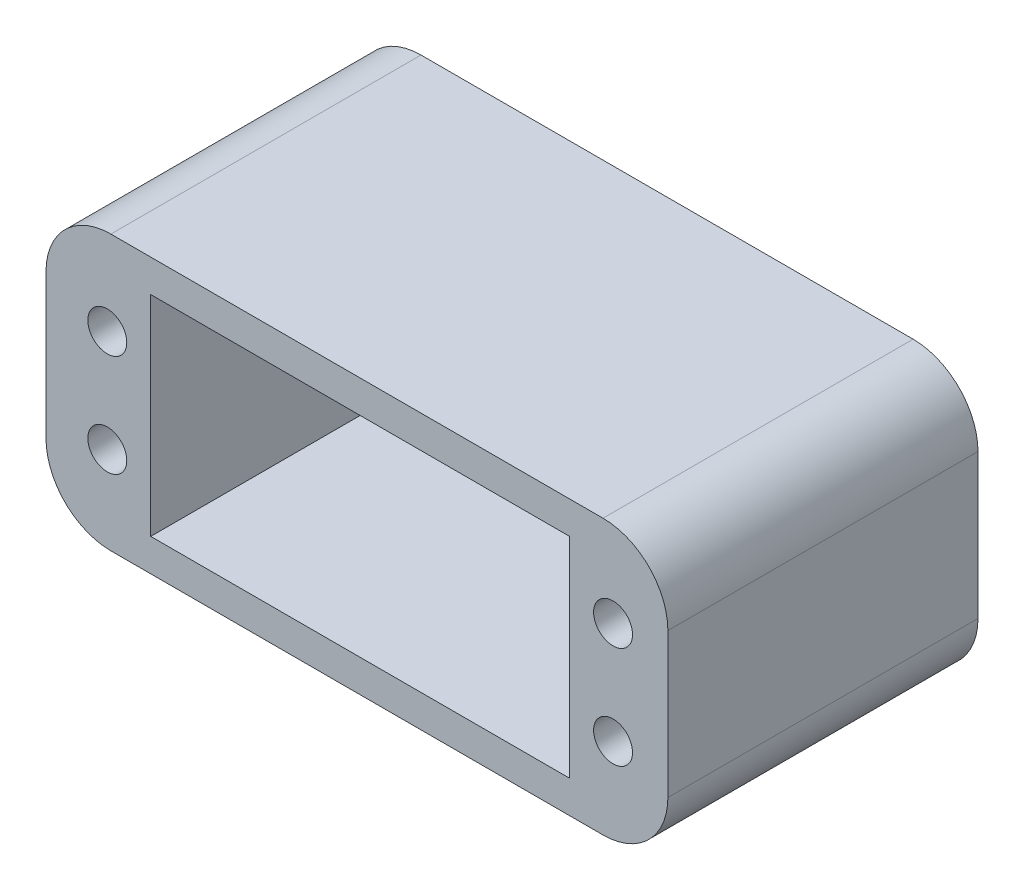
ISO-10303-21;
HEADER;
FILE_DESCRIPTION(('STEP AP214'),'2;1');
FILE_NAME('part.step','',(''),(''),'','','');
FILE_SCHEMA(('AUTOMOTIVE_DESIGN { 1 0 10303 214 1 1 1 1 }'));
ENDSEC;
DATA;
#1=APPLICATION_CONTEXT('core data for automotive mechanical design processes');
#2=APPLICATION_PROTOCOL_DEFINITION('international standard','automotive_design',2000,#1);
#3=PRODUCT_CONTEXT('',#1,'mechanical');
#4=PRODUCT('Part','Part','',(#3));
#5=PRODUCT_RELATED_PRODUCT_CATEGORY('part','',(#4));
#6=PRODUCT_DEFINITION_FORMATION('','',#4);
#7=PRODUCT_DEFINITION_CONTEXT('part definition',#1,'design');
#8=PRODUCT_DEFINITION('design','',#6,#7);
#9=PRODUCT_DEFINITION_SHAPE('','',#8);
#10=(LENGTH_UNIT() NAMED_UNIT(*) SI_UNIT(.MILLI.,.METRE.));
#11=(NAMED_UNIT(*) PLANE_ANGLE_UNIT() SI_UNIT($,.RADIAN.));
#12=(NAMED_UNIT(*) SI_UNIT($,.STERADIAN.) SOLID_ANGLE_UNIT());
#13=UNCERTAINTY_MEASURE_WITH_UNIT(LENGTH_MEASURE(1.E-05),#10,'distance_accuracy_value','');
#14=(GEOMETRIC_REPRESENTATION_CONTEXT(3) GLOBAL_UNCERTAINTY_ASSIGNED_CONTEXT((#13)) GLOBAL_UNIT_ASSIGNED_CONTEXT((#10,
#11,#12)) REPRESENTATION_CONTEXT('',''));
#15=CARTESIAN_POINT('',(0.,0.,0.));
#16=DIRECTION('',(0.,0.,1.));
#17=DIRECTION('',(1.,0.,0.));
#18=AXIS2_PLACEMENT_3D('',#15,#16,#17);
#19=CARTESIAN_POINT('',(23.7658833742651,7.075,15.1765));
#20=DIRECTION('',(0.,0.,-1.));
#21=DIRECTION('',(-1.,0.,0.));
#22=AXIS2_PLACEMENT_3D('',#19,#20,#21);
#23=CYLINDRICAL_SURFACE('',#22,6.35);
#24=CARTESIAN_POINT('',(23.7658833742651,7.075,-15.1765));
#25=DIRECTION('',(0.,0.,1.));
#26=DIRECTION('',(-1.,0.,0.));
#27=AXIS2_PLACEMENT_3D('',#24,#25,#26);
#28=CIRCLE('',#27,6.35);
#29=CARTESIAN_POINT('',(30.1158833742651,7.075,-15.1765));
#30=VERTEX_POINT('',#29);
#31=CARTESIAN_POINT('',(23.7658833742651,13.425,-15.1765));
#32=VERTEX_POINT('',#31);
#33=EDGE_CURVE('E268',#30,#32,#28,.T.);
#34=ORIENTED_EDGE('',*,*,#33,.T.);
#35=DIRECTION('',(0.,0.,-1.));
#36=VECTOR('',#35,1.);
#37=CARTESIAN_POINT('',(23.7658833742651,13.425,15.1765));
#38=LINE('',#37,#36);
#39=CARTESIAN_POINT('',(23.7658833742651,13.425,15.1765));
#40=VERTEX_POINT('',#39);
#41=EDGE_CURVE('E12',#40,#32,#38,.T.);
#42=ORIENTED_EDGE('',*,*,#41,.F.);
#43=CARTESIAN_POINT('',(23.7658833742651,7.075,15.1765));
#44=DIRECTION('',(0.,0.,1.));
#45=DIRECTION('',(-1.,0.,0.));
#46=AXIS2_PLACEMENT_3D('',#43,#44,#45);
#47=CIRCLE('',#46,6.35);
#48=CARTESIAN_POINT('',(30.1158833742651,7.075,15.1765));
#49=VERTEX_POINT('',#48);
#50=EDGE_CURVE('E269',#49,#40,#47,.T.);
#51=ORIENTED_EDGE('',*,*,#50,.F.);
#52=DIRECTION('',(0.,0.,-1.));
#53=VECTOR('',#52,1.);
#54=CARTESIAN_POINT('',(30.1158833742651,7.075,15.1765));
#55=LINE('',#54,#53);
#56=EDGE_CURVE('E295',#49,#30,#55,.T.);
#57=ORIENTED_EDGE('',*,*,#56,.T.);
#58=EDGE_LOOP('',(#34,#42,#51,#57));
#59=FACE_BOUND('',#58,.T.);
#60=ADVANCED_FACE('F40',(#59),#23,.T.);
#61=CARTESIAN_POINT('',(23.7658833742651,13.425,15.1765));
#62=DIRECTION('',(0.,-1.,0.));
#63=DIRECTION('',(1.,0.,0.));
#64=AXIS2_PLACEMENT_3D('',#61,#62,#63);
#65=PLANE('',#64);
#66=DIRECTION('',(-1.,0.,0.));
#67=VECTOR('',#66,1.);
#68=CARTESIAN_POINT('',(23.7658833742651,13.425,-15.1765));
#69=LINE('',#68,#67);
#70=CARTESIAN_POINT('',(-24.4,13.425,-15.1765));
#71=VERTEX_POINT('',#70);
#72=EDGE_CURVE('E299',#32,#71,#69,.T.);
#73=ORIENTED_EDGE('',*,*,#72,.T.);
#74=DIRECTION('',(0.,0.,-1.));
#75=VECTOR('',#74,1.);
#76=CARTESIAN_POINT('',(-24.4,13.425,15.1765));
#77=LINE('',#76,#75);
#78=CARTESIAN_POINT('',(-24.4,13.425,15.1765));
#79=VERTEX_POINT('',#78);
#80=EDGE_CURVE('E48',#79,#71,#77,.T.);
#81=ORIENTED_EDGE('',*,*,#80,.F.);
#82=DIRECTION('',(-1.,0.,0.));
#83=VECTOR('',#82,1.);
#84=CARTESIAN_POINT('',(23.7658833742651,13.425,15.1765));
#85=LINE('',#84,#83);
#86=EDGE_CURVE('E273',#40,#79,#85,.T.);
#87=ORIENTED_EDGE('',*,*,#86,.F.);
#88=ORIENTED_EDGE('',*,*,#41,.T.);
#89=EDGE_LOOP('',(#73,#81,#87,#88));
#90=FACE_BOUND('',#89,.T.);
#91=ADVANCED_FACE('F368',(#90),#65,.F.);
#92=CARTESIAN_POINT('',(-24.4,7.07500000000003,15.1765));
#93=DIRECTION('',(0.,0.,-1.));
#94=DIRECTION('',(-1.,0.,0.));
#95=AXIS2_PLACEMENT_3D('',#92,#93,#94);
#96=CYLINDRICAL_SURFACE('',#95,6.35);
#97=CARTESIAN_POINT('',(-24.4,7.07500000000003,-15.1765));
#98=DIRECTION('',(0.,0.,1.));
#99=DIRECTION('',(1.,0.,0.));
#100=AXIS2_PLACEMENT_3D('',#97,#98,#99);
#101=CIRCLE('',#100,6.35);
#102=CARTESIAN_POINT('',(-30.75,7.07500000000003,-15.1765));
#103=VERTEX_POINT('',#102);
#104=EDGE_CURVE('E302',#71,#103,#101,.T.);
#105=ORIENTED_EDGE('',*,*,#104,.T.);
#106=DIRECTION('',(0.,0.,-1.));
#107=VECTOR('',#106,1.);
#108=CARTESIAN_POINT('',(-30.75,7.07500000000003,15.1765));
#109=LINE('',#108,#107);
#110=CARTESIAN_POINT('',(-30.75,7.07500000000003,15.1765));
#111=VERTEX_POINT('',#110);
#112=EDGE_CURVE('E338',#111,#103,#109,.T.);
#113=ORIENTED_EDGE('',*,*,#112,.F.);
#114=CARTESIAN_POINT('',(-24.4,7.07500000000003,15.1765));
#115=DIRECTION('',(0.,0.,1.));
#116=DIRECTION('',(1.,0.,0.));
#117=AXIS2_PLACEMENT_3D('',#114,#115,#116);
#118=CIRCLE('',#117,6.35);
#119=EDGE_CURVE('E277',#79,#111,#118,.T.);
#120=ORIENTED_EDGE('',*,*,#119,.F.);
#121=ORIENTED_EDGE('',*,*,#80,.T.);
#122=EDGE_LOOP('',(#105,#113,#120,#121));
#123=FACE_BOUND('',#122,.T.);
#124=ADVANCED_FACE('F347',(#123),#96,.T.);
#125=CARTESIAN_POINT('',(-30.75,7.07500000000003,15.1765));
#126=DIRECTION('',(1.,0.,0.));
#127=DIRECTION('',(0.,1.,0.));
#128=AXIS2_PLACEMENT_3D('',#125,#126,#127);
#129=PLANE('',#128);
#130=DIRECTION('',(0.,0.,1.));
#131=VECTOR('',#130,1.);
#132=CARTESIAN_POINT('',(-30.75,-4.76249999999999,-10.3505));
#133=LINE('',#132,#131);
#134=CARTESIAN_POINT('',(-30.75,-4.76249999999999,-10.3505));
#135=VERTEX_POINT('',#134);
#136=CARTESIAN_POINT('',(-30.75,-4.76249999999999,-4.0005));
#137=VERTEX_POINT('',#136);
#138=EDGE_CURVE('E166',#135,#137,#133,.T.);
#139=ORIENTED_EDGE('',*,*,#138,.F.);
#140=DIRECTION('',(0.,-1.,0.));
#141=VECTOR('',#140,1.);
#142=CARTESIAN_POINT('',(-30.75,4.76250000000001,-10.3505));
#143=LINE('',#142,#141);
#144=CARTESIAN_POINT('',(-30.75,4.76250000000001,-10.3505));
#145=VERTEX_POINT('',#144);
#146=EDGE_CURVE('E55',#145,#135,#143,.T.);
#147=ORIENTED_EDGE('',*,*,#146,.F.);
#148=DIRECTION('',(0.,0.,-1.));
#149=VECTOR('',#148,1.);
#150=CARTESIAN_POINT('',(-30.75,4.76250000000001,-10.3505));
#151=LINE('',#150,#149);
#152=CARTESIAN_POINT('',(-30.75,4.76250000000001,-4.0005));
#153=VERTEX_POINT('',#152);
#154=EDGE_CURVE('E174',#153,#145,#151,.T.);
#155=ORIENTED_EDGE('',*,*,#154,.F.);
#156=DIRECTION('',(0.,1.,0.));
#157=VECTOR('',#156,1.);
#158=CARTESIAN_POINT('',(-30.75,4.76250000000001,-4.0005));
#159=LINE('',#158,#157);
#160=EDGE_CURVE('E156',#137,#153,#159,.T.);
#161=ORIENTED_EDGE('',*,*,#160,.F.);
#162=EDGE_LOOP('',(#139,#147,#155,#161));
#163=FACE_BOUND('',#162,.T.);
#164=DIRECTION('',(0.,-1.,0.));
#165=VECTOR('',#164,1.);
#166=CARTESIAN_POINT('',(-30.75,7.07500000000003,-15.1765));
#167=LINE('',#166,#165);
#168=CARTESIAN_POINT('',(-30.75,-7.07500000000001,-15.1765));
#169=VERTEX_POINT('',#168);
#170=EDGE_CURVE('E305',#103,#169,#167,.T.);
#171=ORIENTED_EDGE('',*,*,#170,.T.);
#172=DIRECTION('',(0.,0.,-1.));
#173=VECTOR('',#172,1.);
#174=CARTESIAN_POINT('',(-30.75,-7.07500000000001,15.1765));
#175=LINE('',#174,#173);
#176=CARTESIAN_POINT('',(-30.75,-7.07500000000001,15.1765));
#177=VERTEX_POINT('',#176);
#178=EDGE_CURVE('E334',#177,#169,#175,.T.);
#179=ORIENTED_EDGE('',*,*,#178,.F.);
#180=DIRECTION('',(0.,-1.,0.));
#181=VECTOR('',#180,1.);
#182=CARTESIAN_POINT('',(-30.75,7.07500000000003,15.1765));
#183=LINE('',#182,#181);
#184=EDGE_CURVE('E280',#111,#177,#183,.T.);
#185=ORIENTED_EDGE('',*,*,#184,.F.);
#186=ORIENTED_EDGE('',*,*,#112,.T.);
#187=EDGE_LOOP('',(#171,#179,#185,#186));
#188=FACE_BOUND('',#187,.T.);
#189=ADVANCED_FACE('F171',(#163,#188),#129,.F.);
#190=CARTESIAN_POINT('',(-24.4,-7.07500000000001,15.1765));
#191=DIRECTION('',(0.,0.,-1.));
#192=DIRECTION('',(-1.,0.,0.));
#193=AXIS2_PLACEMENT_3D('',#190,#191,#192);
#194=CYLINDRICAL_SURFACE('',#193,6.35);
#195=CARTESIAN_POINT('',(-24.4,-7.07500000000001,-15.1765));
#196=DIRECTION('',(0.,0.,1.));
#197=DIRECTION('',(1.,0.,0.));
#198=AXIS2_PLACEMENT_3D('',#195,#196,#197);
#199=CIRCLE('',#198,6.35);
#200=CARTESIAN_POINT('',(-24.4,-13.425,-15.1765));
#201=VERTEX_POINT('',#200);
#202=EDGE_CURVE('E308',#169,#201,#199,.T.);
#203=ORIENTED_EDGE('',*,*,#202,.T.);
#204=DIRECTION('',(0.,0.,-1.));
#205=VECTOR('',#204,1.);
#206=CARTESIAN_POINT('',(-24.4,-13.425,15.1765));
#207=LINE('',#206,#205);
#208=CARTESIAN_POINT('',(-24.4,-13.425,15.1765));
#209=VERTEX_POINT('',#208);
#210=EDGE_CURVE('E330',#209,#201,#207,.T.);
#211=ORIENTED_EDGE('',*,*,#210,.F.);
#212=CARTESIAN_POINT('',(-24.4,-7.07500000000001,15.1765));
#213=DIRECTION('',(0.,0.,1.));
#214=DIRECTION('',(1.,0.,0.));
#215=AXIS2_PLACEMENT_3D('',#212,#213,#214);
#216=CIRCLE('',#215,6.35);
#217=EDGE_CURVE('E283',#177,#209,#216,.T.);
#218=ORIENTED_EDGE('',*,*,#217,.F.);
#219=ORIENTED_EDGE('',*,*,#178,.T.);
#220=EDGE_LOOP('',(#203,#211,#218,#219));
#221=FACE_BOUND('',#220,.T.);
#222=ADVANCED_FACE('F360',(#221),#194,.T.);
#223=CARTESIAN_POINT('',(23.7658833742651,-13.425,15.1765));
#224=DIRECTION('',(0.,1.,0.));
#225=DIRECTION('',(-1.,0.,0.));
#226=AXIS2_PLACEMENT_3D('',#223,#224,#225);
#227=PLANE('',#226);
#228=DIRECTION('',(1.,0.,0.));
#229=VECTOR('',#228,1.);
#230=CARTESIAN_POINT('',(23.7658833742651,-13.425,-15.1765));
#231=LINE('',#230,#229);
#232=CARTESIAN_POINT('',(23.7658833742651,-13.425,-15.1765));
#233=VERTEX_POINT('',#232);
#234=EDGE_CURVE('E311',#201,#233,#231,.T.);
#235=ORIENTED_EDGE('',*,*,#234,.T.);
#236=DIRECTION('',(0.,0.,-1.));
#237=VECTOR('',#236,1.);
#238=CARTESIAN_POINT('',(23.7658833742651,-13.425,15.1765));
#239=LINE('',#238,#237);
#240=CARTESIAN_POINT('',(23.7658833742651,-13.425,15.1765));
#241=VERTEX_POINT('',#240);
#242=EDGE_CURVE('E326',#241,#233,#239,.T.);
#243=ORIENTED_EDGE('',*,*,#242,.F.);
#244=DIRECTION('',(1.,0.,0.));
#245=VECTOR('',#244,1.);
#246=CARTESIAN_POINT('',(23.7658833742651,-13.425,15.1765));
#247=LINE('',#246,#245);
#248=EDGE_CURVE('E286',#209,#241,#247,.T.);
#249=ORIENTED_EDGE('',*,*,#248,.F.);
#250=ORIENTED_EDGE('',*,*,#210,.T.);
#251=EDGE_LOOP('',(#235,#243,#249,#250));
#252=FACE_BOUND('',#251,.T.);
#253=ADVANCED_FACE('F381',(#252),#227,.F.);
#254=CARTESIAN_POINT('',(23.7658833742651,-7.07500000000002,15.1765));
#255=DIRECTION('',(0.,0.,-1.));
#256=DIRECTION('',(-1.,0.,0.));
#257=AXIS2_PLACEMENT_3D('',#254,#255,#256);
#258=CYLINDRICAL_SURFACE('',#257,6.35);
#259=CARTESIAN_POINT('',(23.7658833742651,-7.07500000000002,-15.1765));
#260=DIRECTION('',(0.,0.,1.));
#261=DIRECTION('',(1.,0.,0.));
#262=AXIS2_PLACEMENT_3D('',#259,#260,#261);
#263=CIRCLE('',#262,6.35);
#264=CARTESIAN_POINT('',(30.1158833742651,-7.07500000000002,-15.1765));
#265=VERTEX_POINT('',#264);
#266=EDGE_CURVE('E314',#233,#265,#263,.T.);
#267=ORIENTED_EDGE('',*,*,#266,.T.);
#268=DIRECTION('',(0.,0.,-1.));
#269=VECTOR('',#268,1.);
#270=CARTESIAN_POINT('',(30.1158833742651,-7.07500000000002,15.1765));
#271=LINE('',#270,#269);
#272=CARTESIAN_POINT('',(30.1158833742651,-7.07500000000002,15.1765));
#273=VERTEX_POINT('',#272);
#274=EDGE_CURVE('E322',#273,#265,#271,.T.);
#275=ORIENTED_EDGE('',*,*,#274,.F.);
#276=CARTESIAN_POINT('',(23.7658833742651,-7.07500000000002,15.1765));
#277=DIRECTION('',(0.,0.,1.));
#278=DIRECTION('',(1.,0.,0.));
#279=AXIS2_PLACEMENT_3D('',#276,#277,#278);
#280=CIRCLE('',#279,6.35);
#281=EDGE_CURVE('E289',#241,#273,#280,.T.);
#282=ORIENTED_EDGE('',*,*,#281,.F.);
#283=ORIENTED_EDGE('',*,*,#242,.T.);
#284=EDGE_LOOP('',(#267,#275,#282,#283));
#285=FACE_BOUND('',#284,.T.);
#286=ADVANCED_FACE('F379',(#285),#258,.T.);
#287=CARTESIAN_POINT('',(30.1158833742651,-7.07500000000002,15.1765));
#288=DIRECTION('',(-1.,0.,0.));
#289=DIRECTION('',(0.,0.,1.));
#290=AXIS2_PLACEMENT_3D('',#287,#288,#289);
#291=PLANE('',#290);
#292=DIRECTION('',(0.,1.,0.));
#293=VECTOR('',#292,1.);
#294=CARTESIAN_POINT('',(30.1158833742651,-7.07500000000002,-15.1765));
#295=LINE('',#294,#293);
#296=EDGE_CURVE('E274',#265,#30,#295,.T.);
#297=ORIENTED_EDGE('',*,*,#296,.T.);
#298=ORIENTED_EDGE('',*,*,#56,.F.);
#299=DIRECTION('',(0.,1.,0.));
#300=VECTOR('',#299,1.);
#301=CARTESIAN_POINT('',(30.1158833742651,-7.07500000000002,15.1765));
#302=LINE('',#301,#300);
#303=EDGE_CURVE('E292',#273,#49,#302,.T.);
#304=ORIENTED_EDGE('',*,*,#303,.F.);
#305=ORIENTED_EDGE('',*,*,#274,.T.);
#306=EDGE_LOOP('',(#297,#298,#304,#305));
#307=FACE_BOUND('',#306,.T.);
#308=ADVANCED_FACE('F374',(#307),#291,.F.);
#309=CARTESIAN_POINT('',(23.7658833742651,7.075,15.1765));
#310=DIRECTION('',(0.,0.,-1.));
#311=DIRECTION('',(-1.,0.,0.));
#312=AXIS2_PLACEMENT_3D('',#309,#310,#311);
#313=PLANE('',#312);
#314=CARTESIAN_POINT('',(24.75,4.99999999999999,15.1765));
#315=DIRECTION('',(0.,0.,1.));
#316=DIRECTION('',(1.,0.,0.));
#317=AXIS2_PLACEMENT_3D('',#314,#315,#316);
#318=CIRCLE('',#317,1.905);
#319=CARTESIAN_POINT('',(26.655,4.99999999999999,15.1765));
#320=VERTEX_POINT('',#319);
#321=EDGE_CURVE('E191',#320,#320,#318,.T.);
#322=ORIENTED_EDGE('',*,*,#321,.F.);
#323=EDGE_LOOP('',(#322));
#324=FACE_BOUND('',#323,.T.);
#325=CARTESIAN_POINT('',(24.75,-4.99999999999999,15.1765));
#326=DIRECTION('',(0.,0.,1.));
#327=DIRECTION('',(1.,0.,0.));
#328=AXIS2_PLACEMENT_3D('',#325,#326,#327);
#329=CIRCLE('',#328,1.905);
#330=CARTESIAN_POINT('',(26.655,-4.99999999999999,15.1765));
#331=VERTEX_POINT('',#330);
#332=EDGE_CURVE('E206',#331,#331,#329,.T.);
#333=ORIENTED_EDGE('',*,*,#332,.F.);
#334=EDGE_LOOP('',(#333));
#335=FACE_BOUND('',#334,.T.);
#336=CARTESIAN_POINT('',(-24.75,-5.,15.1765));
#337=DIRECTION('',(0.,0.,1.));
#338=DIRECTION('',(1.,0.,0.));
#339=AXIS2_PLACEMENT_3D('',#336,#337,#338);
#340=CIRCLE('',#339,1.905);
#341=CARTESIAN_POINT('',(-22.845,-5.,15.1765));
#342=VERTEX_POINT('',#341);
#343=EDGE_CURVE('E198',#342,#342,#340,.T.);
#344=ORIENTED_EDGE('',*,*,#343,.F.);
#345=EDGE_LOOP('',(#344));
#346=FACE_BOUND('',#345,.T.);
#347=CARTESIAN_POINT('',(-24.75,5.,15.1765));
#348=DIRECTION('',(0.,0.,1.));
#349=DIRECTION('',(1.,0.,0.));
#350=AXIS2_PLACEMENT_3D('',#347,#348,#349);
#351=CIRCLE('',#350,1.905);
#352=CARTESIAN_POINT('',(-22.845,5.,15.1765));
#353=VERTEX_POINT('',#352);
#354=EDGE_CURVE('E197',#353,#353,#351,.T.);
#355=ORIENTED_EDGE('',*,*,#354,.F.);
#356=EDGE_LOOP('',(#355));
#357=FACE_BOUND('',#356,.T.);
#358=DIRECTION('',(1.,0.,0.));
#359=VECTOR('',#358,1.);
#360=CARTESIAN_POINT('',(-20.5,-10.25,15.1765));
#361=LINE('',#360,#359);
#362=CARTESIAN_POINT('',(-20.5,-10.25,15.1765));
#363=VERTEX_POINT('',#362);
#364=CARTESIAN_POINT('',(20.5,-10.25,15.1765));
#365=VERTEX_POINT('',#364);
#366=EDGE_CURVE('E229',#363,#365,#361,.T.);
#367=ORIENTED_EDGE('',*,*,#366,.F.);
#368=DIRECTION('',(0.,-1.,0.));
#369=VECTOR('',#368,1.);
#370=CARTESIAN_POINT('',(-20.5,10.25,15.1765));
#371=LINE('',#370,#369);
#372=CARTESIAN_POINT('',(-20.5,10.25,15.1765));
#373=VERTEX_POINT('',#372);
#374=EDGE_CURVE('E233',#373,#363,#371,.T.);
#375=ORIENTED_EDGE('',*,*,#374,.F.);
#376=DIRECTION('',(-1.,0.,0.));
#377=VECTOR('',#376,1.);
#378=CARTESIAN_POINT('',(20.5,10.25,15.1765));
#379=LINE('',#378,#377);
#380=CARTESIAN_POINT('',(20.5,10.25,15.1765));
#381=VERTEX_POINT('',#380);
#382=EDGE_CURVE('E221',#381,#373,#379,.T.);
#383=ORIENTED_EDGE('',*,*,#382,.F.);
#384=DIRECTION('',(0.,1.,0.));
#385=VECTOR('',#384,1.);
#386=CARTESIAN_POINT('',(20.5,-10.25,15.1765));
#387=LINE('',#386,#385);
#388=EDGE_CURVE('E225',#365,#381,#387,.T.);
#389=ORIENTED_EDGE('',*,*,#388,.F.);
#390=EDGE_LOOP('',(#367,#375,#383,#389));
#391=FACE_BOUND('',#390,.T.);
#392=ORIENTED_EDGE('',*,*,#50,.T.);
#393=ORIENTED_EDGE('',*,*,#86,.T.);
#394=ORIENTED_EDGE('',*,*,#119,.T.);
#395=ORIENTED_EDGE('',*,*,#184,.T.);
#396=ORIENTED_EDGE('',*,*,#217,.T.);
#397=ORIENTED_EDGE('',*,*,#248,.T.);
#398=ORIENTED_EDGE('',*,*,#281,.T.);
#399=ORIENTED_EDGE('',*,*,#303,.T.);
#400=EDGE_LOOP('',(#392,#393,#394,#395,#396,#397,#398,#399));
#401=FACE_BOUND('',#400,.T.);
#402=ADVANCED_FACE('F364',(#324,#335,#346,#357,#391,#401),#313,.F.);
#403=CARTESIAN_POINT('',(23.7658833742651,7.075,-15.1765));
#404=DIRECTION('',(0.,0.,-1.));
#405=DIRECTION('',(-1.,0.,0.));
#406=AXIS2_PLACEMENT_3D('',#403,#404,#405);
#407=PLANE('',#406);
#408=ORIENTED_EDGE('',*,*,#33,.F.);
#409=ORIENTED_EDGE('',*,*,#296,.F.);
#410=ORIENTED_EDGE('',*,*,#266,.F.);
#411=ORIENTED_EDGE('',*,*,#234,.F.);
#412=ORIENTED_EDGE('',*,*,#202,.F.);
#413=ORIENTED_EDGE('',*,*,#170,.F.);
#414=ORIENTED_EDGE('',*,*,#104,.F.);
#415=ORIENTED_EDGE('',*,*,#72,.F.);
#416=EDGE_LOOP('',(#408,#409,#410,#411,#412,#413,#414,#415));
#417=FACE_BOUND('',#416,.T.);
#418=ADVANCED_FACE('F353',(#417),#407,.T.);
#419=CARTESIAN_POINT('',(23.7658833742651,7.075,-12.0015));
#420=DIRECTION('',(0.,0.,-1.));
#421=DIRECTION('',(-1.,0.,0.));
#422=AXIS2_PLACEMENT_3D('',#419,#420,#421);
#423=PLANE('',#422);
#424=DIRECTION('',(-1.,0.,0.));
#425=VECTOR('',#424,1.);
#426=CARTESIAN_POINT('',(20.5,10.25,-12.0015));
#427=LINE('',#426,#425);
#428=CARTESIAN_POINT('',(20.5,10.25,-12.0015));
#429=VERTEX_POINT('',#428);
#430=CARTESIAN_POINT('',(-20.5,10.25,-12.0015));
#431=VERTEX_POINT('',#430);
#432=EDGE_CURVE('E244',#429,#431,#427,.T.);
#433=ORIENTED_EDGE('',*,*,#432,.T.);
#434=DIRECTION('',(0.,-1.,0.));
#435=VECTOR('',#434,1.);
#436=CARTESIAN_POINT('',(-20.5,10.25,-12.0015));
#437=LINE('',#436,#435);
#438=CARTESIAN_POINT('',(-20.5,-10.25,-12.0015));
#439=VERTEX_POINT('',#438);
#440=EDGE_CURVE('E228',#431,#439,#437,.T.);
#441=ORIENTED_EDGE('',*,*,#440,.T.);
#442=DIRECTION('',(1.,0.,0.));
#443=VECTOR('',#442,1.);
#444=CARTESIAN_POINT('',(-20.5,-10.25,-12.0015));
#445=LINE('',#444,#443);
#446=CARTESIAN_POINT('',(20.5,-10.25,-12.0015));
#447=VERTEX_POINT('',#446);
#448=EDGE_CURVE('E255',#439,#447,#445,.T.);
#449=ORIENTED_EDGE('',*,*,#448,.T.);
#450=DIRECTION('',(0.,1.,0.));
#451=VECTOR('',#450,1.);
#452=CARTESIAN_POINT('',(20.5,-10.25,-12.0015));
#453=LINE('',#452,#451);
#454=EDGE_CURVE('E250',#447,#429,#453,.T.);
#455=ORIENTED_EDGE('',*,*,#454,.T.);
#456=EDGE_LOOP('',(#433,#441,#449,#455));
#457=FACE_BOUND('',#456,.T.);
#458=ADVANCED_FACE('F441',(#457),#423,.F.);
#459=CARTESIAN_POINT('',(-20.5,10.25,-61.0158935387457));
#460=DIRECTION('',(-1.,0.,0.));
#461=DIRECTION('',(0.,-1.,0.));
#462=AXIS2_PLACEMENT_3D('',#459,#460,#461);
#463=PLANE('',#462);
#464=DIRECTION('',(0.,0.,1.));
#465=VECTOR('',#464,1.);
#466=CARTESIAN_POINT('',(-20.5,4.76250000000001,-10.3505));
#467=LINE('',#466,#465);
#468=CARTESIAN_POINT('',(-20.5,4.76250000000001,-10.3505));
#469=VERTEX_POINT('',#468);
#470=CARTESIAN_POINT('',(-20.5,4.76250000000001,-4.0005));
#471=VERTEX_POINT('',#470);
#472=EDGE_CURVE('E614',#469,#471,#467,.T.);
#473=ORIENTED_EDGE('',*,*,#472,.F.);
#474=DIRECTION('',(0.,1.,0.));
#475=VECTOR('',#474,1.);
#476=CARTESIAN_POINT('',(-20.5,4.7625,-10.3505));
#477=LINE('',#476,#475);
#478=CARTESIAN_POINT('',(-20.5,-4.76249999999999,-10.3505));
#479=VERTEX_POINT('',#478);
#480=EDGE_CURVE('E192',#479,#469,#477,.T.);
#481=ORIENTED_EDGE('',*,*,#480,.F.);
#482=DIRECTION('',(0.,0.,-1.));
#483=VECTOR('',#482,1.);
#484=CARTESIAN_POINT('',(-20.5,-4.76249999999999,-10.3505));
#485=LINE('',#484,#483);
#486=CARTESIAN_POINT('',(-20.5,-4.76249999999999,-4.0005));
#487=VERTEX_POINT('',#486);
#488=EDGE_CURVE('E188',#487,#479,#485,.T.);
#489=ORIENTED_EDGE('',*,*,#488,.F.);
#490=DIRECTION('',(0.,-1.,0.));
#491=VECTOR('',#490,1.);
#492=CARTESIAN_POINT('',(-20.5,4.7625,-4.0005));
#493=LINE('',#492,#491);
#494=EDGE_CURVE('E159',#471,#487,#493,.T.);
#495=ORIENTED_EDGE('',*,*,#494,.F.);
#496=EDGE_LOOP('',(#473,#481,#489,#495));
#497=FACE_BOUND('',#496,.T.);
#498=DIRECTION('',(0.,0.,1.));
#499=VECTOR('',#498,1.);
#500=CARTESIAN_POINT('',(-20.5,10.25,-61.0158935387457));
#501=LINE('',#500,#499);
#502=EDGE_CURVE('E248',#431,#373,#501,.T.);
#503=ORIENTED_EDGE('',*,*,#502,.T.);
#504=ORIENTED_EDGE('',*,*,#374,.T.);
#505=DIRECTION('',(0.,0.,1.));
#506=VECTOR('',#505,1.);
#507=CARTESIAN_POINT('',(-20.5,-10.25,-61.0158935387457));
#508=LINE('',#507,#506);
#509=EDGE_CURVE('E243',#439,#363,#508,.T.);
#510=ORIENTED_EDGE('',*,*,#509,.F.);
#511=ORIENTED_EDGE('',*,*,#440,.F.);
#512=EDGE_LOOP('',(#503,#504,#510,#511));
#513=FACE_BOUND('',#512,.T.);
#514=ADVANCED_FACE('F450',(#497,#513),#463,.F.);
#515=CARTESIAN_POINT('',(-20.5,-10.25,-61.0158935387457));
#516=DIRECTION('',(0.,-1.,0.));
#517=DIRECTION('',(1.,0.,0.));
#518=AXIS2_PLACEMENT_3D('',#515,#516,#517);
#519=PLANE('',#518);
#520=ORIENTED_EDGE('',*,*,#509,.T.);
#521=ORIENTED_EDGE('',*,*,#366,.T.);
#522=DIRECTION('',(0.,0.,1.));
#523=VECTOR('',#522,1.);
#524=CARTESIAN_POINT('',(20.5,-10.25,-61.0158935387457));
#525=LINE('',#524,#523);
#526=EDGE_CURVE('E254',#447,#365,#525,.T.);
#527=ORIENTED_EDGE('',*,*,#526,.F.);
#528=ORIENTED_EDGE('',*,*,#448,.F.);
#529=EDGE_LOOP('',(#520,#521,#527,#528));
#530=FACE_BOUND('',#529,.T.);
#531=ADVANCED_FACE('F458',(#530),#519,.F.);
#532=CARTESIAN_POINT('',(20.5,-10.25,-61.0158935387457));
#533=DIRECTION('',(1.,0.,0.));
#534=DIRECTION('',(0.,0.,-1.));
#535=AXIS2_PLACEMENT_3D('',#532,#533,#534);
#536=PLANE('',#535);
#537=ORIENTED_EDGE('',*,*,#526,.T.);
#538=ORIENTED_EDGE('',*,*,#388,.T.);
#539=DIRECTION('',(0.,0.,1.));
#540=VECTOR('',#539,1.);
#541=CARTESIAN_POINT('',(20.5,10.25,-61.0158935387457));
#542=LINE('',#541,#540);
#543=EDGE_CURVE('E249',#429,#381,#542,.T.);
#544=ORIENTED_EDGE('',*,*,#543,.F.);
#545=ORIENTED_EDGE('',*,*,#454,.F.);
#546=EDGE_LOOP('',(#537,#538,#544,#545));
#547=FACE_BOUND('',#546,.T.);
#548=ADVANCED_FACE('F463',(#547),#536,.F.);
#549=CARTESIAN_POINT('',(20.5,10.25,-61.0158935387457));
#550=DIRECTION('',(0.,1.,0.));
#551=DIRECTION('',(-1.,0.,0.));
#552=AXIS2_PLACEMENT_3D('',#549,#550,#551);
#553=PLANE('',#552);
#554=ORIENTED_EDGE('',*,*,#543,.T.);
#555=ORIENTED_EDGE('',*,*,#382,.T.);
#556=ORIENTED_EDGE('',*,*,#502,.F.);
#557=ORIENTED_EDGE('',*,*,#432,.F.);
#558=EDGE_LOOP('',(#554,#555,#556,#557));
#559=FACE_BOUND('',#558,.T.);
#560=ADVANCED_FACE('F473',(#559),#553,.F.);
#561=CARTESIAN_POINT('',(-24.75,5.,2.4765));
#562=DIRECTION('',(0.,0.,1.));
#563=DIRECTION('',(1.,0.,0.));
#564=AXIS2_PLACEMENT_3D('',#561,#562,#563);
#565=CYLINDRICAL_SURFACE('',#564,1.905);
#566=CARTESIAN_POINT('',(-24.75,5.,2.4765));
#567=DIRECTION('',(0.,0.,1.));
#568=DIRECTION('',(1.,0.,0.));
#569=AXIS2_PLACEMENT_3D('',#566,#567,#568);
#570=CIRCLE('',#569,1.905);
#571=CARTESIAN_POINT('',(-22.845,5.,2.4765));
#572=VERTEX_POINT('',#571);
#573=EDGE_CURVE('E217',#572,#572,#570,.T.);
#574=ORIENTED_EDGE('',*,*,#573,.F.);
#575=EDGE_LOOP('',(#574));
#576=FACE_BOUND('',#575,.T.);
#577=ORIENTED_EDGE('',*,*,#354,.T.);
#578=EDGE_LOOP('',(#577));
#579=FACE_BOUND('',#578,.T.);
#580=ADVANCED_FACE('F483',(#576,#579),#565,.F.);
#581=CARTESIAN_POINT('',(-24.75,5.,2.4765));
#582=DIRECTION('',(0.,0.,1.));
#583=DIRECTION('',(1.,0.,0.));
#584=AXIS2_PLACEMENT_3D('',#581,#582,#583);
#585=PLANE('',#584);
#586=ORIENTED_EDGE('',*,*,#573,.T.);
#587=EDGE_LOOP('',(#586));
#588=FACE_BOUND('',#587,.T.);
#589=ADVANCED_FACE('F500',(#588),#585,.T.);
#590=CARTESIAN_POINT('',(-24.75,-5.,2.4765));
#591=DIRECTION('',(0.,0.,1.));
#592=DIRECTION('',(1.,0.,0.));
#593=AXIS2_PLACEMENT_3D('',#590,#591,#592);
#594=CYLINDRICAL_SURFACE('',#593,1.905);
#595=CARTESIAN_POINT('',(-24.75,-5.,2.4765));
#596=DIRECTION('',(0.,0.,1.));
#597=DIRECTION('',(1.,0.,0.));
#598=AXIS2_PLACEMENT_3D('',#595,#596,#597);
#599=CIRCLE('',#598,1.905);
#600=CARTESIAN_POINT('',(-22.845,-5.,2.4765));
#601=VERTEX_POINT('',#600);
#602=EDGE_CURVE('E193',#601,#601,#599,.T.);
#603=ORIENTED_EDGE('',*,*,#602,.F.);
#604=EDGE_LOOP('',(#603));
#605=FACE_BOUND('',#604,.T.);
#606=ORIENTED_EDGE('',*,*,#343,.T.);
#607=EDGE_LOOP('',(#606));
#608=FACE_BOUND('',#607,.T.);
#609=ADVANCED_FACE('F510',(#605,#608),#594,.F.);
#610=CARTESIAN_POINT('',(-24.75,-5.,2.4765));
#611=DIRECTION('',(0.,0.,1.));
#612=DIRECTION('',(1.,0.,0.));
#613=AXIS2_PLACEMENT_3D('',#610,#611,#612);
#614=PLANE('',#613);
#615=ORIENTED_EDGE('',*,*,#602,.T.);
#616=EDGE_LOOP('',(#615));
#617=FACE_BOUND('',#616,.T.);
#618=ADVANCED_FACE('F520',(#617),#614,.T.);
#619=CARTESIAN_POINT('',(24.75,-4.99999999999999,2.4765));
#620=DIRECTION('',(0.,0.,1.));
#621=DIRECTION('',(1.,0.,0.));
#622=AXIS2_PLACEMENT_3D('',#619,#620,#621);
#623=CYLINDRICAL_SURFACE('',#622,1.905);
#624=CARTESIAN_POINT('',(24.75,-4.99999999999999,2.4765));
#625=DIRECTION('',(0.,0.,1.));
#626=DIRECTION('',(1.,0.,0.));
#627=AXIS2_PLACEMENT_3D('',#624,#625,#626);
#628=CIRCLE('',#627,1.905);
#629=CARTESIAN_POINT('',(26.655,-4.99999999999999,2.4765));
#630=VERTEX_POINT('',#629);
#631=EDGE_CURVE('E202',#630,#630,#628,.T.);
#632=ORIENTED_EDGE('',*,*,#631,.F.);
#633=EDGE_LOOP('',(#632));
#634=FACE_BOUND('',#633,.T.);
#635=ORIENTED_EDGE('',*,*,#332,.T.);
#636=EDGE_LOOP('',(#635));
#637=FACE_BOUND('',#636,.T.);
#638=ADVANCED_FACE('F530',(#634,#637),#623,.F.);
#639=CARTESIAN_POINT('',(24.75,-4.99999999999999,2.4765));
#640=DIRECTION('',(0.,0.,1.));
#641=DIRECTION('',(1.,0.,0.));
#642=AXIS2_PLACEMENT_3D('',#639,#640,#641);
#643=PLANE('',#642);
#644=ORIENTED_EDGE('',*,*,#631,.T.);
#645=EDGE_LOOP('',(#644));
#646=FACE_BOUND('',#645,.T.);
#647=ADVANCED_FACE('F540',(#646),#643,.T.);
#648=CARTESIAN_POINT('',(24.75,4.99999999999999,2.4765));
#649=DIRECTION('',(0.,0.,1.));
#650=DIRECTION('',(1.,0.,0.));
#651=AXIS2_PLACEMENT_3D('',#648,#649,#650);
#652=CYLINDRICAL_SURFACE('',#651,1.905);
#653=CARTESIAN_POINT('',(24.75,4.99999999999999,2.4765));
#654=DIRECTION('',(0.,0.,1.));
#655=DIRECTION('',(1.,0.,0.));
#656=AXIS2_PLACEMENT_3D('',#653,#654,#655);
#657=CIRCLE('',#656,1.905);
#658=CARTESIAN_POINT('',(26.655,4.99999999999999,2.4765));
#659=VERTEX_POINT('',#658);
#660=EDGE_CURVE('E210',#659,#659,#657,.T.);
#661=ORIENTED_EDGE('',*,*,#660,.F.);
#662=EDGE_LOOP('',(#661));
#663=FACE_BOUND('',#662,.T.);
#664=ORIENTED_EDGE('',*,*,#321,.T.);
#665=EDGE_LOOP('',(#664));
#666=FACE_BOUND('',#665,.T.);
#667=ADVANCED_FACE('F550',(#663,#666),#652,.F.);
#668=CARTESIAN_POINT('',(24.75,4.99999999999999,2.4765));
#669=DIRECTION('',(0.,0.,1.));
#670=DIRECTION('',(1.,0.,0.));
#671=AXIS2_PLACEMENT_3D('',#668,#669,#670);
#672=PLANE('',#671);
#673=ORIENTED_EDGE('',*,*,#660,.T.);
#674=EDGE_LOOP('',(#673));
#675=FACE_BOUND('',#674,.T.);
#676=ADVANCED_FACE('F559',(#675),#672,.T.);
#677=CARTESIAN_POINT('',(-9.05237470040183,4.7625,-10.3505));
#678=DIRECTION('',(0.,0.,-1.));
#679=DIRECTION('',(0.,1.,0.));
#680=AXIS2_PLACEMENT_3D('',#677,#678,#679);
#681=PLANE('',#680);
#682=ORIENTED_EDGE('',*,*,#480,.T.);
#683=DIRECTION('',(-1.,0.,0.));
#684=VECTOR('',#683,1.);
#685=CARTESIAN_POINT('',(-9.05237470040183,4.7625,-10.3505));
#686=LINE('',#685,#684);
#687=EDGE_CURVE('E181',#469,#145,#686,.T.);
#688=ORIENTED_EDGE('',*,*,#687,.T.);
#689=ORIENTED_EDGE('',*,*,#146,.T.);
#690=DIRECTION('',(-1.,0.,0.));
#691=VECTOR('',#690,1.);
#692=CARTESIAN_POINT('',(-9.05237470040183,-4.7625,-10.3505));
#693=LINE('',#692,#691);
#694=EDGE_CURVE('E163',#479,#135,#693,.T.);
#695=ORIENTED_EDGE('',*,*,#694,.F.);
#696=EDGE_LOOP('',(#682,#688,#689,#695));
#697=FACE_BOUND('',#696,.T.);
#698=ADVANCED_FACE('F568',(#697),#681,.F.);
#699=CARTESIAN_POINT('',(-9.05237470040183,4.7625,-10.3505));
#700=DIRECTION('',(0.,1.,0.));
#701=DIRECTION('',(0.,0.,1.));
#702=AXIS2_PLACEMENT_3D('',#699,#700,#701);
#703=PLANE('',#702);
#704=ORIENTED_EDGE('',*,*,#472,.T.);
#705=DIRECTION('',(-1.,0.,0.));
#706=VECTOR('',#705,1.);
#707=CARTESIAN_POINT('',(-9.05237470040183,4.7625,-4.0005));
#708=LINE('',#707,#706);
#709=EDGE_CURVE('E162',#471,#153,#708,.T.);
#710=ORIENTED_EDGE('',*,*,#709,.T.);
#711=ORIENTED_EDGE('',*,*,#154,.T.);
#712=ORIENTED_EDGE('',*,*,#687,.F.);
#713=EDGE_LOOP('',(#704,#710,#711,#712));
#714=FACE_BOUND('',#713,.T.);
#715=ADVANCED_FACE('F579',(#714),#703,.F.);
#716=CARTESIAN_POINT('',(-9.05237470040183,4.7625,-4.0005));
#717=DIRECTION('',(0.,0.,1.));
#718=DIRECTION('',(0.,-1.,0.));
#719=AXIS2_PLACEMENT_3D('',#716,#717,#718);
#720=PLANE('',#719);
#721=ORIENTED_EDGE('',*,*,#494,.T.);
#722=DIRECTION('',(-1.,0.,0.));
#723=VECTOR('',#722,1.);
#724=CARTESIAN_POINT('',(-9.05237470040183,-4.7625,-4.0005));
#725=LINE('',#724,#723);
#726=EDGE_CURVE('E63',#487,#137,#725,.T.);
#727=ORIENTED_EDGE('',*,*,#726,.T.);
#728=ORIENTED_EDGE('',*,*,#160,.T.);
#729=ORIENTED_EDGE('',*,*,#709,.F.);
#730=EDGE_LOOP('',(#721,#727,#728,#729));
#731=FACE_BOUND('',#730,.T.);
#732=ADVANCED_FACE('F153',(#731),#720,.F.);
#733=CARTESIAN_POINT('',(-9.05237470040183,-4.7625,-10.3505));
#734=DIRECTION('',(0.,-1.,0.));
#735=DIRECTION('',(1.,0.,0.));
#736=AXIS2_PLACEMENT_3D('',#733,#734,#735);
#737=PLANE('',#736);
#738=ORIENTED_EDGE('',*,*,#488,.T.);
#739=ORIENTED_EDGE('',*,*,#694,.T.);
#740=ORIENTED_EDGE('',*,*,#138,.T.);
#741=ORIENTED_EDGE('',*,*,#726,.F.);
#742=EDGE_LOOP('',(#738,#739,#740,#741));
#743=FACE_BOUND('',#742,.T.);
#744=ADVANCED_FACE('F167',(#743),#737,.F.);
#745=CLOSED_SHELL('',(#60,#91,#124,#189,#222,#253,#286,#308,#402,#418,#458,#514,#531,#548,#560,
#580,#589,#609,#618,#638,#647,#667,#676,#698,#715,#732,#744));
#746=MANIFOLD_SOLID_BREP('B2',#745);
#747=ADVANCED_BREP_SHAPE_REPRESENTATION('',(#18,#746),#14);
#748=SHAPE_DEFINITION_REPRESENTATION(#9,#747);
ENDSEC;
END-ISO-10303-21;
